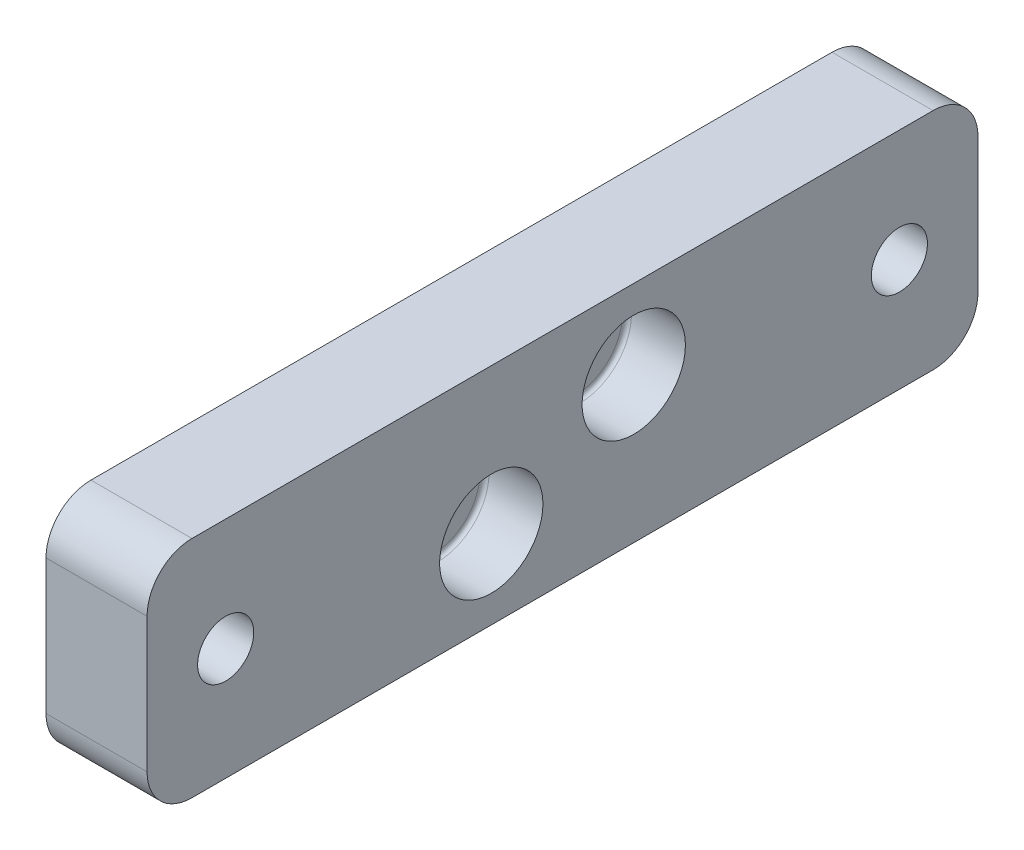
ISO-10303-21;
HEADER;
FILE_DESCRIPTION(('STEP AP214'),'2;1');
FILE_NAME('part.step','',(''),(''),'','','');
FILE_SCHEMA(('AUTOMOTIVE_DESIGN { 1 0 10303 214 1 1 1 1 }'));
ENDSEC;
DATA;
#1=APPLICATION_CONTEXT('core data for automotive mechanical design processes');
#2=APPLICATION_PROTOCOL_DEFINITION('international standard','automotive_design',2000,#1);
#3=PRODUCT_CONTEXT('',#1,'mechanical');
#4=PRODUCT('Part','Part','',(#3));
#5=PRODUCT_RELATED_PRODUCT_CATEGORY('part','',(#4));
#6=PRODUCT_DEFINITION_FORMATION('','',#4);
#7=PRODUCT_DEFINITION_CONTEXT('part definition',#1,'design');
#8=PRODUCT_DEFINITION('design','',#6,#7);
#9=PRODUCT_DEFINITION_SHAPE('','',#8);
#10=(LENGTH_UNIT() NAMED_UNIT(*) SI_UNIT(.MILLI.,.METRE.));
#11=(NAMED_UNIT(*) PLANE_ANGLE_UNIT() SI_UNIT($,.RADIAN.));
#12=(NAMED_UNIT(*) SI_UNIT($,.STERADIAN.) SOLID_ANGLE_UNIT());
#13=UNCERTAINTY_MEASURE_WITH_UNIT(LENGTH_MEASURE(1.E-05),#10,'distance_accuracy_value','');
#14=(GEOMETRIC_REPRESENTATION_CONTEXT(3) GLOBAL_UNCERTAINTY_ASSIGNED_CONTEXT((#13)) GLOBAL_UNIT_ASSIGNED_CONTEXT((#10,
#11,#12)) REPRESENTATION_CONTEXT('',''));
#15=CARTESIAN_POINT('',(0.,0.,0.));
#16=DIRECTION('',(0.,0.,1.));
#17=DIRECTION('',(1.,0.,0.));
#18=AXIS2_PLACEMENT_3D('',#15,#16,#17);
#19=CARTESIAN_POINT('',(5.715,-1.87853817343743,4.0285381133779));
#20=DIRECTION('',(-1.,0.,0.));
#21=DIRECTION('',(0.,0.,1.));
#22=AXIS2_PLACEMENT_3D('',#19,#20,#21);
#23=CYLINDRICAL_SURFACE('',#22,1.6129);
#24=CARTESIAN_POINT('',(0.,-1.87853817343743,4.0285381133779));
#25=DIRECTION('',(1.,0.,0.));
#26=DIRECTION('',(0.,0.,-1.));
#27=AXIS2_PLACEMENT_3D('',#24,#25,#26);
#28=CIRCLE('',#27,1.6129);
#29=CARTESIAN_POINT('',(0.,-1.87853817343743,2.4156381133779));
#30=VERTEX_POINT('',#29);
#31=EDGE_CURVE('E330',#30,#30,#28,.T.);
#32=ORIENTED_EDGE('',*,*,#31,.F.);
#33=EDGE_LOOP('',(#32));
#34=FACE_BOUND('',#33,.T.);
#35=CARTESIAN_POINT('',(2.413,-1.87853817343743,4.0285381133779));
#36=DIRECTION('',(1.,0.,0.));
#37=DIRECTION('',(0.,0.,-1.));
#38=AXIS2_PLACEMENT_3D('',#35,#36,#37);
#39=CIRCLE('',#38,1.6129);
#40=CARTESIAN_POINT('',(2.413,-1.87853817343743,2.4156381133779));
#41=VERTEX_POINT('',#40);
#42=EDGE_CURVE('E169',#41,#41,#39,.T.);
#43=ORIENTED_EDGE('',*,*,#42,.T.);
#44=EDGE_LOOP('',(#43));
#45=FACE_BOUND('',#44,.T.);
#46=ADVANCED_FACE('F49',(#34,#45),#23,.F.);
#47=CARTESIAN_POINT('',(5.715,1.87853817343743,-4.0285381133779));
#48=DIRECTION('',(-1.,0.,0.));
#49=DIRECTION('',(0.,0.,1.));
#50=AXIS2_PLACEMENT_3D('',#47,#48,#49);
#51=CYLINDRICAL_SURFACE('',#50,1.6129);
#52=CARTESIAN_POINT('',(0.,1.87853817343743,-4.0285381133779));
#53=DIRECTION('',(1.,0.,0.));
#54=DIRECTION('',(0.,0.,-1.));
#55=AXIS2_PLACEMENT_3D('',#52,#53,#54);
#56=CIRCLE('',#55,1.6129);
#57=CARTESIAN_POINT('',(0.,1.87853817343743,-5.6414381133779));
#58=VERTEX_POINT('',#57);
#59=EDGE_CURVE('E174',#58,#58,#56,.T.);
#60=ORIENTED_EDGE('',*,*,#59,.F.);
#61=EDGE_LOOP('',(#60));
#62=FACE_BOUND('',#61,.T.);
#63=CARTESIAN_POINT('',(2.413,1.87853817343743,-4.0285381133779));
#64=DIRECTION('',(1.,0.,0.));
#65=DIRECTION('',(0.,0.,-1.));
#66=AXIS2_PLACEMENT_3D('',#63,#64,#65);
#67=CIRCLE('',#66,1.6129);
#68=CARTESIAN_POINT('',(2.413,1.87853817343743,-5.6414381133779));
#69=VERTEX_POINT('',#68);
#70=EDGE_CURVE('E165',#69,#69,#67,.T.);
#71=ORIENTED_EDGE('',*,*,#70,.T.);
#72=EDGE_LOOP('',(#71));
#73=FACE_BOUND('',#72,.T.);
#74=ADVANCED_FACE('F238',(#62,#73),#51,.F.);
#75=CARTESIAN_POINT('',(5.715,0.,0.));
#76=DIRECTION('',(-1.,0.,0.));
#77=DIRECTION('',(0.,0.,1.));
#78=AXIS2_PLACEMENT_3D('',#75,#76,#77);
#79=PLANE('',#78);
#80=CARTESIAN_POINT('',(5.715,-1.87853817343743,4.0285381133779));
#81=DIRECTION('',(1.,0.,0.));
#82=DIRECTION('',(0.,0.,-1.));
#83=AXIS2_PLACEMENT_3D('',#80,#81,#82);
#84=CIRCLE('',#83,2.921);
#85=CARTESIAN_POINT('',(5.715,-1.87853817343743,1.1075381133779));
#86=VERTEX_POINT('',#85);
#87=EDGE_CURVE('E170',#86,#86,#84,.T.);
#88=ORIENTED_EDGE('',*,*,#87,.F.);
#89=EDGE_LOOP('',(#88));
#90=FACE_BOUND('',#89,.T.);
#91=CARTESIAN_POINT('',(5.715,1.87853817343743,-4.0285381133779));
#92=DIRECTION('',(1.,0.,0.));
#93=DIRECTION('',(0.,0.,-1.));
#94=AXIS2_PLACEMENT_3D('',#91,#92,#93);
#95=CIRCLE('',#94,2.921);
#96=CARTESIAN_POINT('',(5.715,1.87853817343743,-6.9495381133779));
#97=VERTEX_POINT('',#96);
#98=EDGE_CURVE('E340',#97,#97,#95,.T.);
#99=ORIENTED_EDGE('',*,*,#98,.F.);
#100=EDGE_LOOP('',(#99));
#101=FACE_BOUND('',#100,.T.);
#102=DIRECTION('',(0.,0.,-1.));
#103=VECTOR('',#102,1.);
#104=CARTESIAN_POINT('',(5.715,-6.35,-23.495));
#105=LINE('',#104,#103);
#106=CARTESIAN_POINT('',(5.715,-6.35,20.955));
#107=VERTEX_POINT('',#106);
#108=CARTESIAN_POINT('',(5.715,-6.35,-20.955));
#109=VERTEX_POINT('',#108);
#110=EDGE_CURVE('E306',#107,#109,#105,.T.);
#111=ORIENTED_EDGE('',*,*,#110,.T.);
#112=CARTESIAN_POINT('',(5.715,-3.81,-20.955));
#113=DIRECTION('',(-1.,0.,0.));
#114=DIRECTION('',(0.,0.,1.));
#115=AXIS2_PLACEMENT_3D('',#112,#113,#114);
#116=CIRCLE('',#115,2.54);
#117=CARTESIAN_POINT('',(5.715,-3.81,-23.495));
#118=VERTEX_POINT('',#117);
#119=EDGE_CURVE('E198',#109,#118,#116,.F.);
#120=ORIENTED_EDGE('',*,*,#119,.T.);
#121=DIRECTION('',(0.,1.,0.));
#122=VECTOR('',#121,1.);
#123=CARTESIAN_POINT('',(5.715,6.35,-23.495));
#124=LINE('',#123,#122);
#125=CARTESIAN_POINT('',(5.715,3.81,-23.495));
#126=VERTEX_POINT('',#125);
#127=EDGE_CURVE('E145',#118,#126,#124,.T.);
#128=ORIENTED_EDGE('',*,*,#127,.T.);
#129=CARTESIAN_POINT('',(5.715,3.81,-20.955));
#130=DIRECTION('',(-1.,0.,0.));
#131=DIRECTION('',(0.,0.,1.));
#132=AXIS2_PLACEMENT_3D('',#129,#130,#131);
#133=CIRCLE('',#132,2.54);
#134=CARTESIAN_POINT('',(5.715,6.35,-20.955));
#135=VERTEX_POINT('',#134);
#136=EDGE_CURVE('E74',#126,#135,#133,.F.);
#137=ORIENTED_EDGE('',*,*,#136,.T.);
#138=DIRECTION('',(0.,0.,1.));
#139=VECTOR('',#138,1.);
#140=CARTESIAN_POINT('',(5.715,6.35,-23.495));
#141=LINE('',#140,#139);
#142=CARTESIAN_POINT('',(5.715,6.35,20.955));
#143=VERTEX_POINT('',#142);
#144=EDGE_CURVE('E176',#135,#143,#141,.T.);
#145=ORIENTED_EDGE('',*,*,#144,.T.);
#146=CARTESIAN_POINT('',(5.715,3.81,20.955));
#147=DIRECTION('',(-1.,0.,0.));
#148=DIRECTION('',(0.,0.,1.));
#149=AXIS2_PLACEMENT_3D('',#146,#147,#148);
#150=CIRCLE('',#149,2.54);
#151=CARTESIAN_POINT('',(5.715,3.81,23.495));
#152=VERTEX_POINT('',#151);
#153=EDGE_CURVE('E190',#143,#152,#150,.F.);
#154=ORIENTED_EDGE('',*,*,#153,.T.);
#155=DIRECTION('',(0.,-1.,0.));
#156=VECTOR('',#155,1.);
#157=CARTESIAN_POINT('',(5.715,6.35,23.495));
#158=LINE('',#157,#156);
#159=CARTESIAN_POINT('',(5.715,-3.81,23.495));
#160=VERTEX_POINT('',#159);
#161=EDGE_CURVE('E159',#152,#160,#158,.T.);
#162=ORIENTED_EDGE('',*,*,#161,.T.);
#163=CARTESIAN_POINT('',(5.715,-3.81,20.955));
#164=DIRECTION('',(-1.,0.,0.));
#165=DIRECTION('',(0.,0.,1.));
#166=AXIS2_PLACEMENT_3D('',#163,#164,#165);
#167=CIRCLE('',#166,2.54);
#168=EDGE_CURVE('E193',#160,#107,#167,.F.);
#169=ORIENTED_EDGE('',*,*,#168,.T.);
#170=EDGE_LOOP('',(#111,#120,#128,#137,#145,#154,#162,#169));
#171=FACE_BOUND('',#170,.T.);
#172=CARTESIAN_POINT('',(5.715,0.,19.05));
#173=DIRECTION('',(1.,0.,0.));
#174=DIRECTION('',(0.,0.,-1.));
#175=AXIS2_PLACEMENT_3D('',#172,#173,#174);
#176=CIRCLE('',#175,1.5875);
#177=CARTESIAN_POINT('',(5.715,0.,17.4625));
#178=VERTEX_POINT('',#177);
#179=EDGE_CURVE('E318',#178,#178,#176,.T.);
#180=ORIENTED_EDGE('',*,*,#179,.F.);
#181=EDGE_LOOP('',(#180));
#182=FACE_BOUND('',#181,.T.);
#183=CARTESIAN_POINT('',(5.715,0.,-19.05));
#184=DIRECTION('',(1.,0.,0.));
#185=DIRECTION('',(0.,0.,1.));
#186=AXIS2_PLACEMENT_3D('',#183,#184,#185);
#187=CIRCLE('',#186,1.5875);
#188=CARTESIAN_POINT('',(5.715,0.,-17.4625));
#189=VERTEX_POINT('',#188);
#190=EDGE_CURVE('E324',#189,#189,#187,.T.);
#191=ORIENTED_EDGE('',*,*,#190,.F.);
#192=EDGE_LOOP('',(#191));
#193=FACE_BOUND('',#192,.T.);
#194=ADVANCED_FACE('F245',(#90,#101,#171,#182,#193),#79,.F.);
#195=CARTESIAN_POINT('',(0.,0.,0.));
#196=DIRECTION('',(-1.,0.,0.));
#197=DIRECTION('',(0.,0.,1.));
#198=AXIS2_PLACEMENT_3D('',#195,#196,#197);
#199=PLANE('',#198);
#200=ORIENTED_EDGE('',*,*,#31,.T.);
#201=EDGE_LOOP('',(#200));
#202=FACE_BOUND('',#201,.T.);
#203=CARTESIAN_POINT('',(0.,0.,19.05));
#204=DIRECTION('',(1.,0.,0.));
#205=DIRECTION('',(0.,0.,-1.));
#206=AXIS2_PLACEMENT_3D('',#203,#204,#205);
#207=CIRCLE('',#206,1.5875);
#208=CARTESIAN_POINT('',(0.,0.,17.4625));
#209=VERTEX_POINT('',#208);
#210=EDGE_CURVE('E311',#209,#209,#207,.T.);
#211=ORIENTED_EDGE('',*,*,#210,.T.);
#212=EDGE_LOOP('',(#211));
#213=FACE_BOUND('',#212,.T.);
#214=DIRECTION('',(0.,1.,0.));
#215=VECTOR('',#214,1.);
#216=CARTESIAN_POINT('',(0.,6.35,-23.495));
#217=LINE('',#216,#215);
#218=CARTESIAN_POINT('',(0.,-3.81,-23.495));
#219=VERTEX_POINT('',#218);
#220=CARTESIAN_POINT('',(0.,3.81,-23.495));
#221=VERTEX_POINT('',#220);
#222=EDGE_CURVE('E143',#219,#221,#217,.T.);
#223=ORIENTED_EDGE('',*,*,#222,.F.);
#224=CARTESIAN_POINT('',(0.,-3.81,-20.955));
#225=DIRECTION('',(-1.,0.,0.));
#226=DIRECTION('',(0.,0.,1.));
#227=AXIS2_PLACEMENT_3D('',#224,#225,#226);
#228=CIRCLE('',#227,2.54);
#229=CARTESIAN_POINT('',(0.,-6.35,-20.955));
#230=VERTEX_POINT('',#229);
#231=EDGE_CURVE('E125',#219,#230,#228,.T.);
#232=ORIENTED_EDGE('',*,*,#231,.T.);
#233=DIRECTION('',(0.,0.,-1.));
#234=VECTOR('',#233,1.);
#235=CARTESIAN_POINT('',(0.,-6.35,-23.495));
#236=LINE('',#235,#234);
#237=CARTESIAN_POINT('',(0.,-6.35,20.955));
#238=VERTEX_POINT('',#237);
#239=EDGE_CURVE('E155',#238,#230,#236,.T.);
#240=ORIENTED_EDGE('',*,*,#239,.F.);
#241=CARTESIAN_POINT('',(0.,-3.81,20.955));
#242=DIRECTION('',(-1.,0.,0.));
#243=DIRECTION('',(0.,0.,1.));
#244=AXIS2_PLACEMENT_3D('',#241,#242,#243);
#245=CIRCLE('',#244,2.54);
#246=CARTESIAN_POINT('',(0.,-3.81,23.495));
#247=VERTEX_POINT('',#246);
#248=EDGE_CURVE('E180',#238,#247,#245,.T.);
#249=ORIENTED_EDGE('',*,*,#248,.T.);
#250=DIRECTION('',(0.,-1.,0.));
#251=VECTOR('',#250,1.);
#252=CARTESIAN_POINT('',(0.,6.35,23.495));
#253=LINE('',#252,#251);
#254=CARTESIAN_POINT('',(0.,3.81,23.495));
#255=VERTEX_POINT('',#254);
#256=EDGE_CURVE('E161',#255,#247,#253,.T.);
#257=ORIENTED_EDGE('',*,*,#256,.F.);
#258=CARTESIAN_POINT('',(0.,3.81,20.955));
#259=DIRECTION('',(-1.,0.,0.));
#260=DIRECTION('',(0.,0.,1.));
#261=AXIS2_PLACEMENT_3D('',#258,#259,#260);
#262=CIRCLE('',#261,2.54);
#263=CARTESIAN_POINT('',(0.,6.35,20.955));
#264=VERTEX_POINT('',#263);
#265=EDGE_CURVE('E147',#255,#264,#262,.T.);
#266=ORIENTED_EDGE('',*,*,#265,.T.);
#267=DIRECTION('',(0.,0.,1.));
#268=VECTOR('',#267,1.);
#269=CARTESIAN_POINT('',(0.,6.35,-23.495));
#270=LINE('',#269,#268);
#271=CARTESIAN_POINT('',(0.,6.35,-20.955));
#272=VERTEX_POINT('',#271);
#273=EDGE_CURVE('E154',#272,#264,#270,.T.);
#274=ORIENTED_EDGE('',*,*,#273,.F.);
#275=CARTESIAN_POINT('',(0.,3.81,-20.955));
#276=DIRECTION('',(-1.,0.,0.));
#277=DIRECTION('',(0.,0.,1.));
#278=AXIS2_PLACEMENT_3D('',#275,#276,#277);
#279=CIRCLE('',#278,2.54);
#280=EDGE_CURVE('E137',#272,#221,#279,.T.);
#281=ORIENTED_EDGE('',*,*,#280,.T.);
#282=EDGE_LOOP('',(#223,#232,#240,#249,#257,#266,#274,#281));
#283=FACE_BOUND('',#282,.T.);
#284=CARTESIAN_POINT('',(0.,0.,-19.05));
#285=DIRECTION('',(1.,0.,0.));
#286=DIRECTION('',(0.,0.,1.));
#287=AXIS2_PLACEMENT_3D('',#284,#285,#286);
#288=CIRCLE('',#287,1.5875);
#289=CARTESIAN_POINT('',(0.,0.,-17.4625));
#290=VERTEX_POINT('',#289);
#291=EDGE_CURVE('E326',#290,#290,#288,.T.);
#292=ORIENTED_EDGE('',*,*,#291,.T.);
#293=EDGE_LOOP('',(#292));
#294=FACE_BOUND('',#293,.T.);
#295=ORIENTED_EDGE('',*,*,#59,.T.);
#296=EDGE_LOOP('',(#295));
#297=FACE_BOUND('',#296,.T.);
#298=ADVANCED_FACE('F150',(#202,#213,#283,#294,#297),#199,.T.);
#299=CARTESIAN_POINT('',(5.715,6.35,23.495));
#300=DIRECTION('',(0.,0.,-1.));
#301=DIRECTION('',(-1.,0.,0.));
#302=AXIS2_PLACEMENT_3D('',#299,#300,#301);
#303=PLANE('',#302);
#304=ORIENTED_EDGE('',*,*,#256,.T.);
#305=DIRECTION('',(-1.,0.,0.));
#306=VECTOR('',#305,1.);
#307=CARTESIAN_POINT('',(5.715,-3.81,23.495));
#308=LINE('',#307,#306);
#309=EDGE_CURVE('E211',#247,#160,#308,.F.);
#310=ORIENTED_EDGE('',*,*,#309,.T.);
#311=ORIENTED_EDGE('',*,*,#161,.F.);
#312=DIRECTION('',(-1.,0.,0.));
#313=VECTOR('',#312,1.);
#314=CARTESIAN_POINT('',(5.715,3.81,23.495));
#315=LINE('',#314,#313);
#316=EDGE_CURVE('E207',#152,#255,#315,.T.);
#317=ORIENTED_EDGE('',*,*,#316,.T.);
#318=EDGE_LOOP('',(#304,#310,#311,#317));
#319=FACE_BOUND('',#318,.T.);
#320=ADVANCED_FACE('F266',(#319),#303,.F.);
#321=CARTESIAN_POINT('',(5.715,-6.35,-23.495));
#322=DIRECTION('',(0.,1.,0.));
#323=DIRECTION('',(0.,0.,1.));
#324=AXIS2_PLACEMENT_3D('',#321,#322,#323);
#325=PLANE('',#324);
#326=ORIENTED_EDGE('',*,*,#239,.T.);
#327=DIRECTION('',(-1.,0.,0.));
#328=VECTOR('',#327,1.);
#329=CARTESIAN_POINT('',(5.715,-6.35,-20.955));
#330=LINE('',#329,#328);
#331=EDGE_CURVE('E130',#230,#109,#330,.F.);
#332=ORIENTED_EDGE('',*,*,#331,.T.);
#333=ORIENTED_EDGE('',*,*,#110,.F.);
#334=DIRECTION('',(-1.,0.,0.));
#335=VECTOR('',#334,1.);
#336=CARTESIAN_POINT('',(5.715,-6.35,20.955));
#337=LINE('',#336,#335);
#338=EDGE_CURVE('E136',#107,#238,#337,.T.);
#339=ORIENTED_EDGE('',*,*,#338,.T.);
#340=EDGE_LOOP('',(#326,#332,#333,#339));
#341=FACE_BOUND('',#340,.T.);
#342=ADVANCED_FACE('F272',(#341),#325,.F.);
#343=CARTESIAN_POINT('',(5.715,6.35,-23.495));
#344=DIRECTION('',(0.,0.,1.));
#345=DIRECTION('',(1.,0.,0.));
#346=AXIS2_PLACEMENT_3D('',#343,#344,#345);
#347=PLANE('',#346);
#348=ORIENTED_EDGE('',*,*,#127,.F.);
#349=DIRECTION('',(-1.,0.,0.));
#350=VECTOR('',#349,1.);
#351=CARTESIAN_POINT('',(5.715,-3.81,-23.495));
#352=LINE('',#351,#350);
#353=EDGE_CURVE('E129',#118,#219,#352,.T.);
#354=ORIENTED_EDGE('',*,*,#353,.T.);
#355=ORIENTED_EDGE('',*,*,#222,.T.);
#356=DIRECTION('',(-1.,0.,0.));
#357=VECTOR('',#356,1.);
#358=CARTESIAN_POINT('',(5.715,3.81,-23.495));
#359=LINE('',#358,#357);
#360=EDGE_CURVE('E148',#221,#126,#359,.F.);
#361=ORIENTED_EDGE('',*,*,#360,.T.);
#362=EDGE_LOOP('',(#348,#354,#355,#361));
#363=FACE_BOUND('',#362,.T.);
#364=ADVANCED_FACE('F142',(#363),#347,.F.);
#365=CARTESIAN_POINT('',(5.715,6.35,-23.495));
#366=DIRECTION('',(0.,-1.,0.));
#367=DIRECTION('',(0.,0.,-1.));
#368=AXIS2_PLACEMENT_3D('',#365,#366,#367);
#369=PLANE('',#368);
#370=ORIENTED_EDGE('',*,*,#144,.F.);
#371=DIRECTION('',(-1.,0.,0.));
#372=VECTOR('',#371,1.);
#373=CARTESIAN_POINT('',(5.715,6.35,-20.955));
#374=LINE('',#373,#372);
#375=EDGE_CURVE('E203',#135,#272,#374,.T.);
#376=ORIENTED_EDGE('',*,*,#375,.T.);
#377=ORIENTED_EDGE('',*,*,#273,.T.);
#378=DIRECTION('',(-1.,0.,0.));
#379=VECTOR('',#378,1.);
#380=CARTESIAN_POINT('',(5.715,6.35,20.955));
#381=LINE('',#380,#379);
#382=EDGE_CURVE('E65',#264,#143,#381,.F.);
#383=ORIENTED_EDGE('',*,*,#382,.T.);
#384=EDGE_LOOP('',(#370,#376,#377,#383));
#385=FACE_BOUND('',#384,.T.);
#386=ADVANCED_FACE('F259',(#385),#369,.F.);
#387=CARTESIAN_POINT('',(5.715,0.,19.05));
#388=DIRECTION('',(-1.,0.,0.));
#389=DIRECTION('',(0.,0.,1.));
#390=AXIS2_PLACEMENT_3D('',#387,#388,#389);
#391=CYLINDRICAL_SURFACE('',#390,1.5875);
#392=ORIENTED_EDGE('',*,*,#179,.T.);
#393=EDGE_LOOP('',(#392));
#394=FACE_BOUND('',#393,.T.);
#395=ORIENTED_EDGE('',*,*,#210,.F.);
#396=EDGE_LOOP('',(#395));
#397=FACE_BOUND('',#396,.T.);
#398=ADVANCED_FACE('F255',(#394,#397),#391,.F.);
#399=CARTESIAN_POINT('',(5.715,0.,-19.05));
#400=DIRECTION('',(-1.,0.,0.));
#401=DIRECTION('',(0.,0.,1.));
#402=AXIS2_PLACEMENT_3D('',#399,#400,#401);
#403=CYLINDRICAL_SURFACE('',#402,1.5875);
#404=ORIENTED_EDGE('',*,*,#190,.T.);
#405=EDGE_LOOP('',(#404));
#406=FACE_BOUND('',#405,.T.);
#407=ORIENTED_EDGE('',*,*,#291,.F.);
#408=EDGE_LOOP('',(#407));
#409=FACE_BOUND('',#408,.T.);
#410=ADVANCED_FACE('F252',(#406,#409),#403,.F.);
#411=CARTESIAN_POINT('',(2.413,1.87853817343743,-4.0285381133779));
#412=DIRECTION('',(1.,0.,0.));
#413=DIRECTION('',(0.,0.,-1.));
#414=AXIS2_PLACEMENT_3D('',#411,#412,#413);
#415=CYLINDRICAL_SURFACE('',#414,2.921);
#416=CARTESIAN_POINT('',(2.667,1.87853817343743,-4.0285381133779));
#417=DIRECTION('',(1.,0.,0.));
#418=DIRECTION('',(0.,0.,-1.));
#419=AXIS2_PLACEMENT_3D('',#416,#417,#418);
#420=CIRCLE('',#419,2.921);
#421=CARTESIAN_POINT('',(2.667,1.87853817343743,-6.9495381133779));
#422=VERTEX_POINT('',#421);
#423=EDGE_CURVE('E11',#422,#422,#420,.F.);
#424=CARTESIAN_POINT('',(2.667,1.87853817343743,-6.9495381133779));
#425=CARTESIAN_POINT('',(2.69875,1.87853817343743,-6.9495381133779));
#426=CARTESIAN_POINT('',(2.7305,1.87853817343743,-6.9495381133779));
#427=CARTESIAN_POINT('',(2.794,1.87853817343743,-6.9495381133779));
#428=CARTESIAN_POINT('',(2.82575,1.87853817343743,-6.9495381133779));
#429=CARTESIAN_POINT('',(2.88925,1.87853817343743,-6.9495381133779));
#430=CARTESIAN_POINT('',(2.921,1.87853817343743,-6.9495381133779));
#431=CARTESIAN_POINT('',(2.9845,1.87853817343743,-6.9495381133779));
#432=CARTESIAN_POINT('',(3.01625,1.87853817343743,-6.9495381133779));
#433=CARTESIAN_POINT('',(3.07975,1.87853817343743,-6.9495381133779));
#434=CARTESIAN_POINT('',(3.1115,1.87853817343743,-6.9495381133779));
#435=CARTESIAN_POINT('',(3.175,1.87853817343743,-6.9495381133779));
#436=CARTESIAN_POINT('',(3.20675,1.87853817343743,-6.9495381133779));
#437=CARTESIAN_POINT('',(3.27025,1.87853817343743,-6.9495381133779));
#438=CARTESIAN_POINT('',(3.302,1.87853817343743,-6.9495381133779));
#439=CARTESIAN_POINT('',(3.3655,1.87853817343743,-6.9495381133779));
#440=CARTESIAN_POINT('',(3.39725,1.87853817343743,-6.9495381133779));
#441=CARTESIAN_POINT('',(3.46075,1.87853817343743,-6.9495381133779));
#442=CARTESIAN_POINT('',(3.4925,1.87853817343743,-6.9495381133779));
#443=CARTESIAN_POINT('',(3.556,1.87853817343743,-6.9495381133779));
#444=CARTESIAN_POINT('',(3.58775,1.87853817343743,-6.9495381133779));
#445=CARTESIAN_POINT('',(3.65125,1.87853817343743,-6.9495381133779));
#446=CARTESIAN_POINT('',(3.683,1.87853817343743,-6.9495381133779));
#447=CARTESIAN_POINT('',(3.7465,1.87853817343743,-6.9495381133779));
#448=CARTESIAN_POINT('',(3.77825,1.87853817343743,-6.9495381133779));
#449=CARTESIAN_POINT('',(3.84175,1.87853817343743,-6.9495381133779));
#450=CARTESIAN_POINT('',(3.8735,1.87853817343743,-6.9495381133779));
#451=CARTESIAN_POINT('',(3.937,1.87853817343743,-6.9495381133779));
#452=CARTESIAN_POINT('',(3.96875,1.87853817343743,-6.9495381133779));
#453=CARTESIAN_POINT('',(4.03225,1.87853817343743,-6.9495381133779));
#454=CARTESIAN_POINT('',(4.064,1.87853817343743,-6.9495381133779));
#455=CARTESIAN_POINT('',(4.1275,1.87853817343743,-6.9495381133779));
#456=CARTESIAN_POINT('',(4.15925,1.87853817343743,-6.9495381133779));
#457=CARTESIAN_POINT('',(4.22275,1.87853817343743,-6.9495381133779));
#458=CARTESIAN_POINT('',(4.2545,1.87853817343743,-6.9495381133779));
#459=CARTESIAN_POINT('',(4.318,1.87853817343743,-6.9495381133779));
#460=CARTESIAN_POINT('',(4.34975,1.87853817343743,-6.9495381133779));
#461=CARTESIAN_POINT('',(4.41325,1.87853817343743,-6.9495381133779));
#462=CARTESIAN_POINT('',(4.445,1.87853817343743,-6.9495381133779));
#463=CARTESIAN_POINT('',(4.5085,1.87853817343743,-6.9495381133779));
#464=CARTESIAN_POINT('',(4.54025,1.87853817343743,-6.9495381133779));
#465=CARTESIAN_POINT('',(4.60375,1.87853817343743,-6.9495381133779));
#466=CARTESIAN_POINT('',(4.6355,1.87853817343743,-6.9495381133779));
#467=CARTESIAN_POINT('',(4.699,1.87853817343743,-6.9495381133779));
#468=CARTESIAN_POINT('',(4.73075,1.87853817343743,-6.9495381133779));
#469=CARTESIAN_POINT('',(4.79425,1.87853817343743,-6.9495381133779));
#470=CARTESIAN_POINT('',(4.826,1.87853817343743,-6.9495381133779));
#471=CARTESIAN_POINT('',(4.8895,1.87853817343743,-6.9495381133779));
#472=CARTESIAN_POINT('',(4.92125,1.87853817343743,-6.9495381133779));
#473=CARTESIAN_POINT('',(4.98475,1.87853817343743,-6.9495381133779));
#474=CARTESIAN_POINT('',(5.0165,1.87853817343743,-6.9495381133779));
#475=CARTESIAN_POINT('',(5.08,1.87853817343743,-6.9495381133779));
#476=CARTESIAN_POINT('',(5.11175,1.87853817343743,-6.9495381133779));
#477=CARTESIAN_POINT('',(5.17525,1.87853817343743,-6.9495381133779));
#478=CARTESIAN_POINT('',(5.207,1.87853817343743,-6.9495381133779));
#479=CARTESIAN_POINT('',(5.2705,1.87853817343743,-6.9495381133779));
#480=CARTESIAN_POINT('',(5.30225,1.87853817343743,-6.9495381133779));
#481=CARTESIAN_POINT('',(5.36575,1.87853817343743,-6.9495381133779));
#482=CARTESIAN_POINT('',(5.3975,1.87853817343743,-6.9495381133779));
#483=CARTESIAN_POINT('',(5.461,1.87853817343743,-6.9495381133779));
#484=CARTESIAN_POINT('',(5.49275,1.87853817343743,-6.9495381133779));
#485=CARTESIAN_POINT('',(5.55625,1.87853817343743,-6.9495381133779));
#486=CARTESIAN_POINT('',(5.588,1.87853817343743,-6.9495381133779));
#487=CARTESIAN_POINT('',(5.6515,1.87853817343743,-6.9495381133779));
#488=CARTESIAN_POINT('',(5.68325,1.87853817343743,-6.9495381133779));
#489=CARTESIAN_POINT('',(5.715,1.87853817343743,-6.9495381133779));
#490=B_SPLINE_CURVE_WITH_KNOTS('',3,(#424,#425,#426,#427,#428,#429,#430,#431,#432,#433,#434,
#435,#436,#437,#438,#439,#440,#441,#442,#443,#444,#445,#446,#447,#448,#449,#450,#451,#452,#453,
#454,#455,#456,#457,#458,#459,#460,#461,#462,#463,#464,#465,#466,#467,#468,#469,#470,#471,#472,
#473,#474,#475,#476,#477,#478,#479,#480,#481,#482,#483,#484,#485,#486,#487,#488,#489),
.UNSPECIFIED.,.F.,.F.,(4,2,2,2,2,2,2,2,2,2,2,2,2,2,2,2,2,2,2,2,2,2,2,2,2,2,2,2,2,2,2,2,4),(0.,
0.0952499999999998,0.1905,0.28575,0.381,0.47625,0.5715,0.66675,0.761999999999999,0.85725,0.9525,
1.04775,1.143,1.23825,1.3335,1.42875,1.524,1.61925,1.7145,1.80975,1.905,2.00025,2.0955,2.19075,
2.286,2.38125,2.4765,2.57175,2.667,2.76225,2.8575,2.95275,3.048),.UNSPECIFIED.);
#491=EDGE_CURVE('BSEAM254',#422,#97,#490,.T.);
#492=ORIENTED_EDGE('',*,*,#423,.T.);
#493=ORIENTED_EDGE('',*,*,#98,.T.);
#494=ORIENTED_EDGE('',*,*,#491,.T.);
#495=ORIENTED_EDGE('',*,*,#491,.F.);
#496=EDGE_LOOP('',(#492,#494,#493,#495));
#497=FACE_BOUND('',#496,.T.);
#498=ADVANCED_FACE('F254',(#497),#415,.F.);
#499=CARTESIAN_POINT('',(2.413,1.87853817343743,-4.0285381133779));
#500=DIRECTION('',(1.,0.,0.));
#501=DIRECTION('',(0.,0.,-1.));
#502=AXIS2_PLACEMENT_3D('',#499,#500,#501);
#503=PLANE('',#502);
#504=CARTESIAN_POINT('',(2.413,1.87853817343743,-4.0285381133779));
#505=DIRECTION('',(1.,0.,0.));
#506=DIRECTION('',(0.,0.,-1.));
#507=AXIS2_PLACEMENT_3D('',#504,#505,#506);
#508=CIRCLE('',#507,2.667);
#509=CARTESIAN_POINT('',(2.413,1.87853817343743,-6.6955381133779));
#510=VERTEX_POINT('',#509);
#511=EDGE_CURVE('E58',#510,#510,#508,.T.);
#512=ORIENTED_EDGE('',*,*,#511,.T.);
#513=EDGE_LOOP('',(#512));
#514=FACE_BOUND('',#513,.T.);
#515=ORIENTED_EDGE('',*,*,#70,.F.);
#516=EDGE_LOOP('',(#515));
#517=FACE_BOUND('',#516,.T.);
#518=ADVANCED_FACE('F225',(#514,#517),#503,.T.);
#519=CARTESIAN_POINT('',(2.413,-1.87853817343743,4.0285381133779));
#520=DIRECTION('',(1.,0.,0.));
#521=DIRECTION('',(0.,0.,-1.));
#522=AXIS2_PLACEMENT_3D('',#519,#520,#521);
#523=CYLINDRICAL_SURFACE('',#522,2.921);
#524=CARTESIAN_POINT('',(2.667,-1.87853817343743,4.0285381133779));
#525=DIRECTION('',(1.,0.,0.));
#526=DIRECTION('',(0.,0.,-1.));
#527=AXIS2_PLACEMENT_3D('',#524,#525,#526);
#528=CIRCLE('',#527,2.921);
#529=CARTESIAN_POINT('',(2.667,-1.87853817343743,1.1075381133779));
#530=VERTEX_POINT('',#529);
#531=EDGE_CURVE('E218',#530,#530,#528,.F.);
#532=CARTESIAN_POINT('',(2.667,-1.87853817343743,1.1075381133779));
#533=CARTESIAN_POINT('',(2.69875,-1.87853817343743,1.1075381133779));
#534=CARTESIAN_POINT('',(2.7305,-1.87853817343743,1.1075381133779));
#535=CARTESIAN_POINT('',(2.794,-1.87853817343743,1.1075381133779));
#536=CARTESIAN_POINT('',(2.82575,-1.87853817343743,1.1075381133779));
#537=CARTESIAN_POINT('',(2.88925,-1.87853817343743,1.1075381133779));
#538=CARTESIAN_POINT('',(2.921,-1.87853817343743,1.1075381133779));
#539=CARTESIAN_POINT('',(2.9845,-1.87853817343743,1.1075381133779));
#540=CARTESIAN_POINT('',(3.01625,-1.87853817343743,1.1075381133779));
#541=CARTESIAN_POINT('',(3.07975,-1.87853817343743,1.1075381133779));
#542=CARTESIAN_POINT('',(3.1115,-1.87853817343743,1.1075381133779));
#543=CARTESIAN_POINT('',(3.175,-1.87853817343743,1.1075381133779));
#544=CARTESIAN_POINT('',(3.20675,-1.87853817343743,1.1075381133779));
#545=CARTESIAN_POINT('',(3.27025,-1.87853817343743,1.1075381133779));
#546=CARTESIAN_POINT('',(3.302,-1.87853817343743,1.1075381133779));
#547=CARTESIAN_POINT('',(3.3655,-1.87853817343743,1.1075381133779));
#548=CARTESIAN_POINT('',(3.39725,-1.87853817343743,1.1075381133779));
#549=CARTESIAN_POINT('',(3.46075,-1.87853817343743,1.1075381133779));
#550=CARTESIAN_POINT('',(3.4925,-1.87853817343743,1.1075381133779));
#551=CARTESIAN_POINT('',(3.556,-1.87853817343743,1.1075381133779));
#552=CARTESIAN_POINT('',(3.58775,-1.87853817343743,1.1075381133779));
#553=CARTESIAN_POINT('',(3.65125,-1.87853817343743,1.1075381133779));
#554=CARTESIAN_POINT('',(3.683,-1.87853817343743,1.1075381133779));
#555=CARTESIAN_POINT('',(3.7465,-1.87853817343743,1.1075381133779));
#556=CARTESIAN_POINT('',(3.77825,-1.87853817343743,1.1075381133779));
#557=CARTESIAN_POINT('',(3.84175,-1.87853817343743,1.1075381133779));
#558=CARTESIAN_POINT('',(3.8735,-1.87853817343743,1.1075381133779));
#559=CARTESIAN_POINT('',(3.937,-1.87853817343743,1.1075381133779));
#560=CARTESIAN_POINT('',(3.96875,-1.87853817343743,1.1075381133779));
#561=CARTESIAN_POINT('',(4.03225,-1.87853817343743,1.1075381133779));
#562=CARTESIAN_POINT('',(4.064,-1.87853817343743,1.1075381133779));
#563=CARTESIAN_POINT('',(4.1275,-1.87853817343743,1.1075381133779));
#564=CARTESIAN_POINT('',(4.15925,-1.87853817343743,1.1075381133779));
#565=CARTESIAN_POINT('',(4.22275,-1.87853817343743,1.1075381133779));
#566=CARTESIAN_POINT('',(4.2545,-1.87853817343743,1.1075381133779));
#567=CARTESIAN_POINT('',(4.318,-1.87853817343743,1.1075381133779));
#568=CARTESIAN_POINT('',(4.34975,-1.87853817343743,1.1075381133779));
#569=CARTESIAN_POINT('',(4.41325,-1.87853817343743,1.1075381133779));
#570=CARTESIAN_POINT('',(4.445,-1.87853817343743,1.1075381133779));
#571=CARTESIAN_POINT('',(4.5085,-1.87853817343743,1.1075381133779));
#572=CARTESIAN_POINT('',(4.54025,-1.87853817343743,1.1075381133779));
#573=CARTESIAN_POINT('',(4.60375,-1.87853817343743,1.1075381133779));
#574=CARTESIAN_POINT('',(4.6355,-1.87853817343743,1.1075381133779));
#575=CARTESIAN_POINT('',(4.699,-1.87853817343743,1.1075381133779));
#576=CARTESIAN_POINT('',(4.73075,-1.87853817343743,1.1075381133779));
#577=CARTESIAN_POINT('',(4.79425,-1.87853817343743,1.1075381133779));
#578=CARTESIAN_POINT('',(4.826,-1.87853817343743,1.1075381133779));
#579=CARTESIAN_POINT('',(4.8895,-1.87853817343743,1.1075381133779));
#580=CARTESIAN_POINT('',(4.92125,-1.87853817343743,1.1075381133779));
#581=CARTESIAN_POINT('',(4.98475,-1.87853817343743,1.1075381133779));
#582=CARTESIAN_POINT('',(5.0165,-1.87853817343743,1.1075381133779));
#583=CARTESIAN_POINT('',(5.08,-1.87853817343743,1.1075381133779));
#584=CARTESIAN_POINT('',(5.11175,-1.87853817343743,1.1075381133779));
#585=CARTESIAN_POINT('',(5.17525,-1.87853817343743,1.1075381133779));
#586=CARTESIAN_POINT('',(5.207,-1.87853817343743,1.1075381133779));
#587=CARTESIAN_POINT('',(5.2705,-1.87853817343743,1.1075381133779));
#588=CARTESIAN_POINT('',(5.30225,-1.87853817343743,1.1075381133779));
#589=CARTESIAN_POINT('',(5.36575,-1.87853817343743,1.1075381133779));
#590=CARTESIAN_POINT('',(5.3975,-1.87853817343743,1.1075381133779));
#591=CARTESIAN_POINT('',(5.461,-1.87853817343743,1.1075381133779));
#592=CARTESIAN_POINT('',(5.49275,-1.87853817343743,1.1075381133779));
#593=CARTESIAN_POINT('',(5.55625,-1.87853817343743,1.1075381133779));
#594=CARTESIAN_POINT('',(5.588,-1.87853817343743,1.1075381133779));
#595=CARTESIAN_POINT('',(5.6515,-1.87853817343743,1.1075381133779));
#596=CARTESIAN_POINT('',(5.68325,-1.87853817343743,1.1075381133779));
#597=CARTESIAN_POINT('',(5.715,-1.87853817343743,1.1075381133779));
#598=B_SPLINE_CURVE_WITH_KNOTS('',3,(#532,#533,#534,#535,#536,#537,#538,#539,#540,#541,#542,
#543,#544,#545,#546,#547,#548,#549,#550,#551,#552,#553,#554,#555,#556,#557,#558,#559,#560,#561,
#562,#563,#564,#565,#566,#567,#568,#569,#570,#571,#572,#573,#574,#575,#576,#577,#578,#579,#580,
#581,#582,#583,#584,#585,#586,#587,#588,#589,#590,#591,#592,#593,#594,#595,#596,#597),
.UNSPECIFIED.,.F.,.F.,(4,2,2,2,2,2,2,2,2,2,2,2,2,2,2,2,2,2,2,2,2,2,2,2,2,2,2,2,2,2,2,2,4),(0.,
0.0952499999999998,0.1905,0.28575,0.381,0.47625,0.5715,0.66675,0.761999999999999,0.85725,0.9525,
1.04775,1.143,1.23825,1.3335,1.42875,1.524,1.61925,1.7145,1.80975,1.905,2.00025,2.0955,2.19075,
2.286,2.38125,2.4765,2.57175,2.667,2.76225,2.8575,2.95275,3.048),.UNSPECIFIED.);
#599=EDGE_CURVE('BSEAM348',#530,#86,#598,.T.);
#600=ORIENTED_EDGE('',*,*,#531,.T.);
#601=ORIENTED_EDGE('',*,*,#87,.T.);
#602=ORIENTED_EDGE('',*,*,#599,.T.);
#603=ORIENTED_EDGE('',*,*,#599,.F.);
#604=EDGE_LOOP('',(#600,#602,#601,#603));
#605=FACE_BOUND('',#604,.T.);
#606=ADVANCED_FACE('F348',(#605),#523,.F.);
#607=CARTESIAN_POINT('',(2.413,-1.87853817343743,4.0285381133779));
#608=DIRECTION('',(1.,0.,0.));
#609=DIRECTION('',(0.,0.,-1.));
#610=AXIS2_PLACEMENT_3D('',#607,#608,#609);
#611=PLANE('',#610);
#612=CARTESIAN_POINT('',(2.413,-1.87853817343743,4.0285381133779));
#613=DIRECTION('',(1.,0.,0.));
#614=DIRECTION('',(0.,0.,-1.));
#615=AXIS2_PLACEMENT_3D('',#612,#613,#614);
#616=CIRCLE('',#615,2.667);
#617=CARTESIAN_POINT('',(2.413,-1.87853817343743,1.3615381133779));
#618=VERTEX_POINT('',#617);
#619=EDGE_CURVE('E214',#618,#618,#616,.T.);
#620=ORIENTED_EDGE('',*,*,#619,.T.);
#621=EDGE_LOOP('',(#620));
#622=FACE_BOUND('',#621,.T.);
#623=ORIENTED_EDGE('',*,*,#42,.F.);
#624=EDGE_LOOP('',(#623));
#625=FACE_BOUND('',#624,.T.);
#626=ADVANCED_FACE('F282',(#622,#625),#611,.T.);
#627=CARTESIAN_POINT('',(5.715,-3.81,-20.955));
#628=DIRECTION('',(-1.,0.,0.));
#629=DIRECTION('',(0.,0.,1.));
#630=AXIS2_PLACEMENT_3D('',#627,#628,#629);
#631=CYLINDRICAL_SURFACE('',#630,2.54);
#632=ORIENTED_EDGE('',*,*,#119,.F.);
#633=ORIENTED_EDGE('',*,*,#331,.F.);
#634=ORIENTED_EDGE('',*,*,#231,.F.);
#635=ORIENTED_EDGE('',*,*,#353,.F.);
#636=EDGE_LOOP('',(#632,#633,#634,#635));
#637=FACE_BOUND('',#636,.T.);
#638=ADVANCED_FACE('F128',(#637),#631,.T.);
#639=CARTESIAN_POINT('',(5.715,3.81,-20.955));
#640=DIRECTION('',(-1.,0.,0.));
#641=DIRECTION('',(0.,0.,1.));
#642=AXIS2_PLACEMENT_3D('',#639,#640,#641);
#643=CYLINDRICAL_SURFACE('',#642,2.54);
#644=ORIENTED_EDGE('',*,*,#136,.F.);
#645=ORIENTED_EDGE('',*,*,#360,.F.);
#646=ORIENTED_EDGE('',*,*,#280,.F.);
#647=ORIENTED_EDGE('',*,*,#375,.F.);
#648=EDGE_LOOP('',(#644,#645,#646,#647));
#649=FACE_BOUND('',#648,.T.);
#650=ADVANCED_FACE('F281',(#649),#643,.T.);
#651=CARTESIAN_POINT('',(5.715,-3.81,20.955));
#652=DIRECTION('',(-1.,0.,0.));
#653=DIRECTION('',(0.,0.,1.));
#654=AXIS2_PLACEMENT_3D('',#651,#652,#653);
#655=CYLINDRICAL_SURFACE('',#654,2.54);
#656=ORIENTED_EDGE('',*,*,#168,.F.);
#657=ORIENTED_EDGE('',*,*,#309,.F.);
#658=ORIENTED_EDGE('',*,*,#248,.F.);
#659=ORIENTED_EDGE('',*,*,#338,.F.);
#660=EDGE_LOOP('',(#656,#657,#658,#659));
#661=FACE_BOUND('',#660,.T.);
#662=ADVANCED_FACE('F285',(#661),#655,.T.);
#663=CARTESIAN_POINT('',(5.715,3.81,20.955));
#664=DIRECTION('',(-1.,0.,0.));
#665=DIRECTION('',(0.,0.,1.));
#666=AXIS2_PLACEMENT_3D('',#663,#664,#665);
#667=CYLINDRICAL_SURFACE('',#666,2.54);
#668=ORIENTED_EDGE('',*,*,#153,.F.);
#669=ORIENTED_EDGE('',*,*,#382,.F.);
#670=ORIENTED_EDGE('',*,*,#265,.F.);
#671=ORIENTED_EDGE('',*,*,#316,.F.);
#672=EDGE_LOOP('',(#668,#669,#670,#671));
#673=FACE_BOUND('',#672,.T.);
#674=ADVANCED_FACE('F234',(#673),#667,.T.);
#675=CARTESIAN_POINT('',(2.667,-1.87853817343743,4.0285381133779));
#676=DIRECTION('',(1.,0.,0.));
#677=DIRECTION('',(0.,0.,-1.));
#678=AXIS2_PLACEMENT_3D('',#675,#676,#677);
#679=TOROIDAL_SURFACE('',#678,2.667,0.254);
#680=ORIENTED_EDGE('',*,*,#531,.F.);
#681=EDGE_LOOP('',(#680));
#682=FACE_BOUND('',#681,.T.);
#683=ORIENTED_EDGE('',*,*,#619,.F.);
#684=EDGE_LOOP('',(#683));
#685=FACE_BOUND('',#684,.T.);
#686=ADVANCED_FACE('F229',(#682,#685),#679,.F.);
#687=CARTESIAN_POINT('',(2.667,1.87853817343743,-4.0285381133779));
#688=DIRECTION('',(1.,0.,0.));
#689=DIRECTION('',(0.,0.,-1.));
#690=AXIS2_PLACEMENT_3D('',#687,#688,#689);
#691=TOROIDAL_SURFACE('',#690,2.667,0.254);
#692=ORIENTED_EDGE('',*,*,#423,.F.);
#693=EDGE_LOOP('',(#692));
#694=FACE_BOUND('',#693,.T.);
#695=ORIENTED_EDGE('',*,*,#511,.F.);
#696=EDGE_LOOP('',(#695));
#697=FACE_BOUND('',#696,.T.);
#698=ADVANCED_FACE('F51',(#694,#697),#691,.F.);
#699=CLOSED_SHELL('',(#46,#74,#194,#298,#320,#342,#364,#386,#398,#410,#498,#518,#606,#626,#638,
#650,#662,#674,#686,#698));
#700=MANIFOLD_SOLID_BREP('B2',#699);
#701=ADVANCED_BREP_SHAPE_REPRESENTATION('',(#18,#700),#14);
#702=SHAPE_DEFINITION_REPRESENTATION(#9,#701);
ENDSEC;
END-ISO-10303-21;
